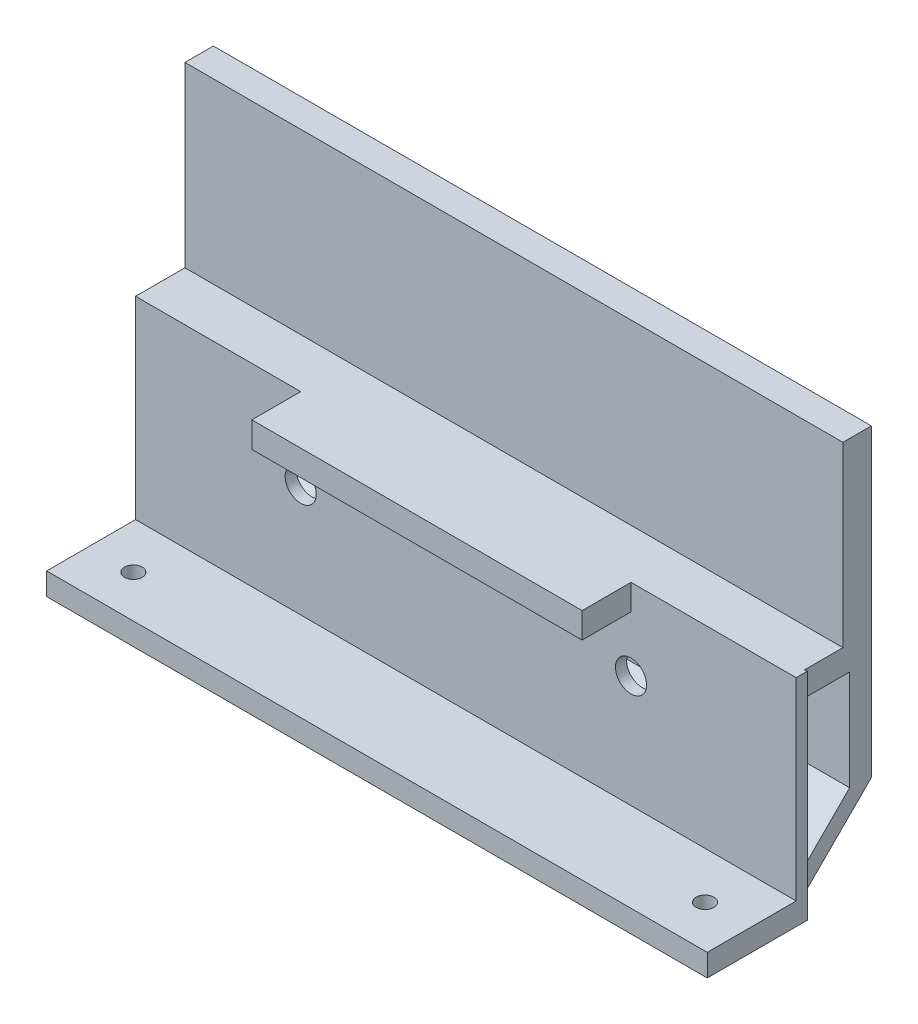
ISO-10303-21;
HEADER;
FILE_DESCRIPTION(('STEP AP214'),'2;1');
FILE_NAME('part.step','',(''),(''),'','','');
FILE_SCHEMA(('AUTOMOTIVE_DESIGN { 1 0 10303 214 1 1 1 1 }'));
ENDSEC;
DATA;
#1=APPLICATION_CONTEXT('core data for automotive mechanical design processes');
#2=APPLICATION_PROTOCOL_DEFINITION('international standard','automotive_design',2000,#1);
#3=PRODUCT_CONTEXT('',#1,'mechanical');
#4=PRODUCT('Part','Part','',(#3));
#5=PRODUCT_RELATED_PRODUCT_CATEGORY('part','',(#4));
#6=PRODUCT_DEFINITION_FORMATION('','',#4);
#7=PRODUCT_DEFINITION_CONTEXT('part definition',#1,'design');
#8=PRODUCT_DEFINITION('design','',#6,#7);
#9=PRODUCT_DEFINITION_SHAPE('','',#8);
#10=(LENGTH_UNIT() NAMED_UNIT(*) SI_UNIT(.MILLI.,.METRE.));
#11=(NAMED_UNIT(*) PLANE_ANGLE_UNIT() SI_UNIT($,.RADIAN.));
#12=(NAMED_UNIT(*) SI_UNIT($,.STERADIAN.) SOLID_ANGLE_UNIT());
#13=UNCERTAINTY_MEASURE_WITH_UNIT(LENGTH_MEASURE(1.E-05),#10,'distance_accuracy_value','');
#14=(GEOMETRIC_REPRESENTATION_CONTEXT(3) GLOBAL_UNCERTAINTY_ASSIGNED_CONTEXT((#13)) GLOBAL_UNIT_ASSIGNED_CONTEXT((#10,
#11,#12)) REPRESENTATION_CONTEXT('',''));
#15=CARTESIAN_POINT('',(0.,0.,0.));
#16=DIRECTION('',(0.,0.,1.));
#17=DIRECTION('',(1.,0.,0.));
#18=AXIS2_PLACEMENT_3D('',#15,#16,#17);
#19=CARTESIAN_POINT('',(0.,48.5,-36.4955621612228));
#20=DIRECTION('',(0.,-1.,0.));
#21=DIRECTION('',(0.,0.,-1.));
#22=AXIS2_PLACEMENT_3D('',#19,#20,#21);
#23=PLANE('',#22);
#24=DIRECTION('',(1.,0.,0.));
#25=VECTOR('',#24,1.);
#26=CARTESIAN_POINT('',(68.543865825632,48.5,-47.5965621612228));
#27=LINE('',#26,#25);
#28=CARTESIAN_POINT('',(-79.456134174368,48.5,-47.5965621612228));
#29=VERTEX_POINT('',#28);
#30=CARTESIAN_POINT('',(68.543865825632,48.5,-47.5965621612228));
#31=VERTEX_POINT('',#30);
#32=EDGE_CURVE('E64',#29,#31,#27,.T.);
#33=ORIENTED_EDGE('',*,*,#32,.F.);
#34=DIRECTION('',(0.,0.,-1.));
#35=VECTOR('',#34,1.);
#36=CARTESIAN_POINT('',(-79.456134174368,48.5,-36.4955621612228));
#37=LINE('',#36,#35);
#38=CARTESIAN_POINT('',(-79.456134174368,48.5,-36.4955621612228));
#39=VERTEX_POINT('',#38);
#40=EDGE_CURVE('E342',#39,#29,#37,.T.);
#41=ORIENTED_EDGE('',*,*,#40,.F.);
#42=DIRECTION('',(-1.,0.,0.));
#43=VECTOR('',#42,1.);
#44=CARTESIAN_POINT('',(0.,48.5,-36.4955621612228));
#45=LINE('',#44,#43);
#46=CARTESIAN_POINT('',(-42.308634174368,48.5,-36.4955621612228));
#47=VERTEX_POINT('',#46);
#48=EDGE_CURVE('E332',#47,#39,#45,.T.);
#49=ORIENTED_EDGE('',*,*,#48,.F.);
#50=DIRECTION('',(0.,0.,-1.));
#51=VECTOR('',#50,1.);
#52=CARTESIAN_POINT('',(-42.308634174368,48.5,-25.4955621612228));
#53=LINE('',#52,#51);
#54=CARTESIAN_POINT('',(-42.308634174368,48.5,-25.4955621612228));
#55=VERTEX_POINT('',#54);
#56=EDGE_CURVE('E247',#55,#47,#53,.T.);
#57=ORIENTED_EDGE('',*,*,#56,.F.);
#58=DIRECTION('',(-1.,0.,0.));
#59=VECTOR('',#58,1.);
#60=CARTESIAN_POINT('',(0.,48.5,-25.4955621612228));
#61=LINE('',#60,#59);
#62=CARTESIAN_POINT('',(31.986365825632,48.5,-25.4955621612228));
#63=VERTEX_POINT('',#62);
#64=EDGE_CURVE('E229',#63,#55,#61,.T.);
#65=ORIENTED_EDGE('',*,*,#64,.F.);
#66=DIRECTION('',(0.,0.,-1.));
#67=VECTOR('',#66,1.);
#68=CARTESIAN_POINT('',(31.986365825632,48.5,-25.4955621612228));
#69=LINE('',#68,#67);
#70=CARTESIAN_POINT('',(31.986365825632,48.5,-36.4955621612228));
#71=VERTEX_POINT('',#70);
#72=EDGE_CURVE('E249',#63,#71,#69,.T.);
#73=ORIENTED_EDGE('',*,*,#72,.T.);
#74=CARTESIAN_POINT('',(69.133865825632,48.5,-36.4955621612228));
#75=VERTEX_POINT('',#74);
#76=EDGE_CURVE('E333',#75,#71,#45,.T.);
#77=ORIENTED_EDGE('',*,*,#76,.F.);
#78=DIRECTION('',(0.,0.,-1.));
#79=VECTOR('',#78,1.);
#80=CARTESIAN_POINT('',(69.133865825632,48.5,-36.4955621612228));
#81=LINE('',#80,#79);
#82=CARTESIAN_POINT('',(69.133865825632,48.5,-38.9965621612228));
#83=VERTEX_POINT('',#82);
#84=EDGE_CURVE('E349',#75,#83,#81,.T.);
#85=ORIENTED_EDGE('',*,*,#84,.T.);
#86=DIRECTION('',(-1.,0.,0.));
#87=VECTOR('',#86,1.);
#88=CARTESIAN_POINT('',(0.,48.5,-38.9965621612228));
#89=LINE('',#88,#87);
#90=CARTESIAN_POINT('',(68.543865825632,48.5,-38.9965621612228));
#91=VERTEX_POINT('',#90);
#92=EDGE_CURVE('E311',#83,#91,#89,.T.);
#93=ORIENTED_EDGE('',*,*,#92,.T.);
#94=DIRECTION('',(0.,0.,-1.));
#95=VECTOR('',#94,1.);
#96=CARTESIAN_POINT('',(68.543865825632,48.5,0.));
#97=LINE('',#96,#95);
#98=EDGE_CURVE('E300',#91,#31,#97,.T.);
#99=ORIENTED_EDGE('',*,*,#98,.T.);
#100=EDGE_LOOP('',(#33,#41,#49,#57,#65,#73,#77,#85,#93,#99));
#101=FACE_BOUND('',#100,.T.);
#102=ADVANCED_FACE('F47',(#101),#23,.F.);
#103=CARTESIAN_POINT('',(-42.308634174368,30.25,-184.495562161223));
#104=DIRECTION('',(0.,0.,1.));
#105=DIRECTION('',(1.,0.,0.));
#106=AXIS2_PLACEMENT_3D('',#103,#104,#105);
#107=CYLINDRICAL_SURFACE('',#106,3.5);
#108=CARTESIAN_POINT('',(-42.308634174368,30.25,-38.9965621612228));
#109=DIRECTION('',(0.,0.,1.));
#110=DIRECTION('',(1.,0.,0.));
#111=AXIS2_PLACEMENT_3D('',#108,#109,#110);
#112=CIRCLE('',#111,3.5);
#113=CARTESIAN_POINT('',(-38.808634174368,30.25,-38.9965621612228));
#114=VERTEX_POINT('',#113);
#115=EDGE_CURVE('E275',#114,#114,#112,.F.);
#116=ORIENTED_EDGE('',*,*,#115,.T.);
#117=EDGE_LOOP('',(#116));
#118=FACE_BOUND('',#117,.T.);
#119=CARTESIAN_POINT('',(-42.308634174368,30.25,-36.4955621612228));
#120=DIRECTION('',(0.,0.,1.));
#121=DIRECTION('',(1.,0.,0.));
#122=AXIS2_PLACEMENT_3D('',#119,#120,#121);
#123=CIRCLE('',#122,3.5);
#124=CARTESIAN_POINT('',(-38.808634174368,30.25,-36.4955621612228));
#125=VERTEX_POINT('',#124);
#126=EDGE_CURVE('E287',#125,#125,#123,.T.);
#127=ORIENTED_EDGE('',*,*,#126,.T.);
#128=EDGE_LOOP('',(#127));
#129=FACE_BOUND('',#128,.T.);
#130=ADVANCED_FACE('F472',(#118,#129),#107,.F.);
#131=CARTESIAN_POINT('',(31.986365825632,30.25,-184.495562161223));
#132=DIRECTION('',(0.,0.,1.));
#133=DIRECTION('',(1.,0.,0.));
#134=AXIS2_PLACEMENT_3D('',#131,#132,#133);
#135=CYLINDRICAL_SURFACE('',#134,3.5);
#136=CARTESIAN_POINT('',(31.986365825632,30.25,-38.9965621612228));
#137=DIRECTION('',(0.,0.,1.));
#138=DIRECTION('',(1.,0.,0.));
#139=AXIS2_PLACEMENT_3D('',#136,#137,#138);
#140=CIRCLE('',#139,3.5);
#141=CARTESIAN_POINT('',(35.486365825632,30.25,-38.9965621612228));
#142=VERTEX_POINT('',#141);
#143=EDGE_CURVE('E51',#142,#142,#140,.F.);
#144=ORIENTED_EDGE('',*,*,#143,.T.);
#145=EDGE_LOOP('',(#144));
#146=FACE_BOUND('',#145,.T.);
#147=CARTESIAN_POINT('',(31.986365825632,30.25,-36.4955621612228));
#148=DIRECTION('',(0.,0.,1.));
#149=DIRECTION('',(1.,0.,0.));
#150=AXIS2_PLACEMENT_3D('',#147,#148,#149);
#151=CIRCLE('',#150,3.5);
#152=CARTESIAN_POINT('',(35.486365825632,30.25,-36.4955621612228));
#153=VERTEX_POINT('',#152);
#154=EDGE_CURVE('E288',#153,#153,#151,.T.);
#155=ORIENTED_EDGE('',*,*,#154,.T.);
#156=EDGE_LOOP('',(#155));
#157=FACE_BOUND('',#156,.T.);
#158=ADVANCED_FACE('F477',(#146,#157),#135,.F.);
#159=CARTESIAN_POINT('',(0.,5.,-16.4955621612228));
#160=DIRECTION('',(0.,0.,-1.));
#161=DIRECTION('',(-1.,0.,0.));
#162=AXIS2_PLACEMENT_3D('',#159,#160,#161);
#163=PLANE('',#162);
#164=DIRECTION('',(1.,0.,0.));
#165=VECTOR('',#164,1.);
#166=CARTESIAN_POINT('',(0.,0.,-16.4955621612228));
#167=LINE('',#166,#165);
#168=CARTESIAN_POINT('',(-79.456134174368,0.,-16.4955621612228));
#169=VERTEX_POINT('',#168);
#170=CARTESIAN_POINT('',(69.133865825632,0.,-16.4955621612228));
#171=VERTEX_POINT('',#170);
#172=EDGE_CURVE('E345',#169,#171,#167,.T.);
#173=ORIENTED_EDGE('',*,*,#172,.T.);
#174=DIRECTION('',(0.,-1.,0.));
#175=VECTOR('',#174,1.);
#176=CARTESIAN_POINT('',(69.133865825632,5.,-16.4955621612228));
#177=LINE('',#176,#175);
#178=CARTESIAN_POINT('',(69.133865825632,5.,-16.4955621612228));
#179=VERTEX_POINT('',#178);
#180=EDGE_CURVE('E13',#179,#171,#177,.T.);
#181=ORIENTED_EDGE('',*,*,#180,.F.);
#182=DIRECTION('',(1.,0.,0.));
#183=VECTOR('',#182,1.);
#184=CARTESIAN_POINT('',(0.,5.,-16.4955621612228));
#185=LINE('',#184,#183);
#186=CARTESIAN_POINT('',(-79.456134174368,5.,-16.4955621612228));
#187=VERTEX_POINT('',#186);
#188=EDGE_CURVE('E352',#187,#179,#185,.T.);
#189=ORIENTED_EDGE('',*,*,#188,.F.);
#190=DIRECTION('',(0.,-1.,0.));
#191=VECTOR('',#190,1.);
#192=CARTESIAN_POINT('',(-79.456134174368,5.,-16.4955621612228));
#193=LINE('',#192,#191);
#194=EDGE_CURVE('E363',#187,#169,#193,.T.);
#195=ORIENTED_EDGE('',*,*,#194,.T.);
#196=EDGE_LOOP('',(#173,#181,#189,#195));
#197=FACE_BOUND('',#196,.T.);
#198=ADVANCED_FACE('F49',(#197),#163,.F.);
#199=CARTESIAN_POINT('',(69.133865825632,5.,0.));
#200=DIRECTION('',(-1.,0.,0.));
#201=DIRECTION('',(0.,0.,1.));
#202=AXIS2_PLACEMENT_3D('',#199,#200,#201);
#203=PLANE('',#202);
#204=DIRECTION('',(0.,0.,-1.));
#205=VECTOR('',#204,1.);
#206=CARTESIAN_POINT('',(69.133865825632,0.,0.));
#207=LINE('',#206,#205);
#208=CARTESIAN_POINT('',(69.133865825632,0.,-38.9955621612228));
#209=VERTEX_POINT('',#208);
#210=EDGE_CURVE('E366',#171,#209,#207,.T.);
#211=ORIENTED_EDGE('',*,*,#210,.T.);
#212=DIRECTION('',(0.,-1.,0.));
#213=VECTOR('',#212,1.);
#214=CARTESIAN_POINT('',(69.133865825632,5.,-38.9955621612228));
#215=LINE('',#214,#213);
#216=CARTESIAN_POINT('',(69.133865825632,5.,-38.9955621612228));
#217=VERTEX_POINT('',#216);
#218=EDGE_CURVE('E56',#217,#209,#215,.T.);
#219=ORIENTED_EDGE('',*,*,#218,.F.);
#220=DIRECTION('',(0.,0.,-1.));
#221=VECTOR('',#220,1.);
#222=CARTESIAN_POINT('',(69.133865825632,5.,-36.4955621612228));
#223=LINE('',#222,#221);
#224=CARTESIAN_POINT('',(69.133865825632,5.,-38.9965621612228));
#225=VERTEX_POINT('',#224);
#226=EDGE_CURVE('E346',#217,#225,#223,.T.);
#227=ORIENTED_EDGE('',*,*,#226,.T.);
#228=DIRECTION('',(0.,-1.,0.));
#229=VECTOR('',#228,1.);
#230=CARTESIAN_POINT('',(69.133865825632,0.,-38.9965621612228));
#231=LINE('',#230,#229);
#232=EDGE_CURVE('E322',#83,#225,#231,.T.);
#233=ORIENTED_EDGE('',*,*,#232,.F.);
#234=ORIENTED_EDGE('',*,*,#84,.F.);
#235=DIRECTION('',(0.,-1.,0.));
#236=VECTOR('',#235,1.);
#237=CARTESIAN_POINT('',(69.133865825632,0.,-36.4955621612228));
#238=LINE('',#237,#236);
#239=CARTESIAN_POINT('',(69.133865825632,5.,-36.4955621612228));
#240=VERTEX_POINT('',#239);
#241=EDGE_CURVE('E336',#75,#240,#238,.T.);
#242=ORIENTED_EDGE('',*,*,#241,.T.);
#243=DIRECTION('',(0.,0.,-1.));
#244=VECTOR('',#243,1.);
#245=CARTESIAN_POINT('',(69.133865825632,5.,0.));
#246=LINE('',#245,#244);
#247=EDGE_CURVE('E355',#179,#240,#246,.T.);
#248=ORIENTED_EDGE('',*,*,#247,.F.);
#249=ORIENTED_EDGE('',*,*,#180,.T.);
#250=EDGE_LOOP('',(#211,#219,#227,#233,#234,#242,#248,#249));
#251=FACE_BOUND('',#250,.T.);
#252=ADVANCED_FACE('F432',(#251),#203,.F.);
#253=CARTESIAN_POINT('',(0.,5.,-38.9955621612228));
#254=DIRECTION('',(0.,0.,-1.));
#255=DIRECTION('',(-1.,0.,0.));
#256=AXIS2_PLACEMENT_3D('',#253,#254,#255);
#257=PLANE('',#256);
#258=DIRECTION('',(1.,0.,0.));
#259=VECTOR('',#258,1.);
#260=CARTESIAN_POINT('',(0.,0.,-38.9955621612228));
#261=LINE('',#260,#259);
#262=CARTESIAN_POINT('',(-79.456134174368,0.,-38.9955621612228));
#263=VERTEX_POINT('',#262);
#264=EDGE_CURVE('E369',#263,#209,#261,.T.);
#265=ORIENTED_EDGE('',*,*,#264,.F.);
#266=DIRECTION('',(0.,-1.,0.));
#267=VECTOR('',#266,1.);
#268=CARTESIAN_POINT('',(-79.456134174368,5.,-38.9955621612228));
#269=LINE('',#268,#267);
#270=CARTESIAN_POINT('',(-79.456134174368,5.,-38.9955621612228));
#271=VERTEX_POINT('',#270);
#272=EDGE_CURVE('E375',#271,#263,#269,.T.);
#273=ORIENTED_EDGE('',*,*,#272,.F.);
#274=DIRECTION('',(1.,0.,0.));
#275=VECTOR('',#274,1.);
#276=CARTESIAN_POINT('',(0.,5.,-38.9955621612228));
#277=LINE('',#276,#275);
#278=EDGE_CURVE('E358',#271,#217,#277,.T.);
#279=ORIENTED_EDGE('',*,*,#278,.T.);
#280=ORIENTED_EDGE('',*,*,#218,.T.);
#281=EDGE_LOOP('',(#265,#273,#279,#280));
#282=FACE_BOUND('',#281,.T.);
#283=ADVANCED_FACE('F430',(#282),#257,.T.);
#284=CARTESIAN_POINT('',(-79.456134174368,5.,0.));
#285=DIRECTION('',(1.,0.,0.));
#286=DIRECTION('',(0.,0.,-1.));
#287=AXIS2_PLACEMENT_3D('',#284,#285,#286);
#288=PLANE('',#287);
#289=DIRECTION('',(0.,0.,1.));
#290=VECTOR('',#289,1.);
#291=CARTESIAN_POINT('',(-79.456134174368,43.0152324436079,0.));
#292=LINE('',#291,#290);
#293=CARTESIAN_POINT('',(-79.456134174368,43.0152324436079,-49.1099327899107));
#294=VERTEX_POINT('',#293);
#295=CARTESIAN_POINT('',(-79.456134174368,43.0152324436079,-38.9965621612228));
#296=VERTEX_POINT('',#295);
#297=EDGE_CURVE('E284',#294,#296,#292,.T.);
#298=ORIENTED_EDGE('',*,*,#297,.T.);
#299=DIRECTION('',(0.,-1.,0.));
#300=VECTOR('',#299,1.);
#301=CARTESIAN_POINT('',(-79.456134174368,5.,-38.9965621612228));
#302=LINE('',#301,#300);
#303=CARTESIAN_POINT('',(-79.456134174368,10.3369467408914,-38.9965621612228));
#304=VERTEX_POINT('',#303);
#305=EDGE_CURVE('E278',#296,#304,#302,.T.);
#306=ORIENTED_EDGE('',*,*,#305,.T.);
#307=DIRECTION('',(0.,0.707106781186565,-0.70710678118653));
#308=VECTOR('',#307,1.);
#309=CARTESIAN_POINT('',(-79.456134174368,-11.8298077101658,-16.8298077101667));
#310=LINE('',#309,#308);
#311=CARTESIAN_POINT('',(-79.456134174368,20.4503173695798,-49.1099327899107));
#312=VERTEX_POINT('',#311);
#313=EDGE_CURVE('E281',#304,#312,#310,.T.);
#314=ORIENTED_EDGE('',*,*,#313,.T.);
#315=DIRECTION('',(0.,1.,0.));
#316=VECTOR('',#315,1.);
#317=CARTESIAN_POINT('',(-79.456134174368,5.,-49.1099327899107));
#318=LINE('',#317,#316);
#319=EDGE_CURVE('E272',#312,#294,#318,.T.);
#320=ORIENTED_EDGE('',*,*,#319,.T.);
#321=EDGE_LOOP('',(#298,#306,#314,#320));
#322=FACE_BOUND('',#321,.T.);
#323=DIRECTION('',(0.,0.,1.));
#324=VECTOR('',#323,1.);
#325=CARTESIAN_POINT('',(-79.456134174368,0.,0.));
#326=LINE('',#325,#324);
#327=EDGE_CURVE('E356',#263,#169,#326,.T.);
#328=ORIENTED_EDGE('',*,*,#327,.T.);
#329=ORIENTED_EDGE('',*,*,#194,.F.);
#330=DIRECTION('',(0.,0.,1.));
#331=VECTOR('',#330,1.);
#332=CARTESIAN_POINT('',(-79.456134174368,5.,0.));
#333=LINE('',#332,#331);
#334=CARTESIAN_POINT('',(-79.456134174368,5.,-36.4955621612228));
#335=VERTEX_POINT('',#334);
#336=EDGE_CURVE('E361',#335,#187,#333,.T.);
#337=ORIENTED_EDGE('',*,*,#336,.F.);
#338=DIRECTION('',(0.,-1.,0.));
#339=VECTOR('',#338,1.);
#340=CARTESIAN_POINT('',(-79.456134174368,0.,-36.4955621612228));
#341=LINE('',#340,#339);
#342=EDGE_CURVE('E329',#39,#335,#341,.T.);
#343=ORIENTED_EDGE('',*,*,#342,.F.);
#344=ORIENTED_EDGE('',*,*,#40,.T.);
#345=DIRECTION('',(0.,-1.,0.));
#346=VECTOR('',#345,1.);
#347=CARTESIAN_POINT('',(-79.456134174368,88.5,-47.5965621612228));
#348=LINE('',#347,#346);
#349=CARTESIAN_POINT('',(-79.456134174368,88.5,-47.5965621612228));
#350=VERTEX_POINT('',#349);
#351=EDGE_CURVE('E207',#350,#29,#348,.T.);
#352=ORIENTED_EDGE('',*,*,#351,.F.);
#353=DIRECTION('',(0.,0.,1.));
#354=VECTOR('',#353,1.);
#355=CARTESIAN_POINT('',(-79.456134174368,88.5,-53.9965621612228));
#356=LINE('',#355,#354);
#357=CARTESIAN_POINT('',(-79.456134174368,88.5,-53.9965621612228));
#358=VERTEX_POINT('',#357);
#359=EDGE_CURVE('E204',#358,#350,#356,.T.);
#360=ORIENTED_EDGE('',*,*,#359,.F.);
#361=DIRECTION('',(0.,1.,0.));
#362=VECTOR('',#361,1.);
#363=CARTESIAN_POINT('',(-79.456134174368,0.,-53.9965621612228));
#364=LINE('',#363,#362);
#365=CARTESIAN_POINT('',(-79.456134174368,19.9999999999999,-53.9965621612228));
#366=VERTEX_POINT('',#365);
#367=EDGE_CURVE('E190',#366,#358,#364,.T.);
#368=ORIENTED_EDGE('',*,*,#367,.F.);
#369=DIRECTION('',(0.,0.707106781186544,-0.707106781186551));
#370=VECTOR('',#369,1.);
#371=CARTESIAN_POINT('',(-79.456134174368,-16.9982810806114,-16.9982810806112));
#372=LINE('',#371,#370);
#373=CARTESIAN_POINT('',(-79.456134174368,5.,-38.9965621612228));
#374=VERTEX_POINT('',#373);
#375=EDGE_CURVE('E201',#374,#366,#372,.T.);
#376=ORIENTED_EDGE('',*,*,#375,.F.);
#377=DIRECTION('',(0.,0.,-1.));
#378=VECTOR('',#377,1.);
#379=CARTESIAN_POINT('',(-79.456134174368,5.,-36.4955621612228));
#380=LINE('',#379,#378);
#381=EDGE_CURVE('E343',#271,#374,#380,.T.);
#382=ORIENTED_EDGE('',*,*,#381,.F.);
#383=ORIENTED_EDGE('',*,*,#272,.T.);
#384=EDGE_LOOP('',(#328,#329,#337,#343,#344,#352,#360,#368,#376,#382,#383));
#385=FACE_BOUND('',#384,.T.);
#386=ADVANCED_FACE('F205',(#322,#385),#288,.F.);
#387=CARTESIAN_POINT('',(0.,5.,0.));
#388=DIRECTION('',(0.,1.,0.));
#389=DIRECTION('',(0.,0.,1.));
#390=AXIS2_PLACEMENT_3D('',#387,#388,#389);
#391=PLANE('',#390);
#392=CARTESIAN_POINT('',(59.133865825632,5.,-25.9955621612228));
#393=DIRECTION('',(0.,-1.,0.));
#394=DIRECTION('',(0.,0.,-1.));
#395=AXIS2_PLACEMENT_3D('',#392,#393,#394);
#396=CIRCLE('',#395,2.);
#397=CARTESIAN_POINT('',(59.133865825632,5.,-27.9955621612228));
#398=VERTEX_POINT('',#397);
#399=EDGE_CURVE('E308',#398,#398,#396,.T.);
#400=ORIENTED_EDGE('',*,*,#399,.T.);
#401=EDGE_LOOP('',(#400));
#402=FACE_BOUND('',#401,.T.);
#403=CARTESIAN_POINT('',(-69.456134174368,5.,-25.9955621612228));
#404=DIRECTION('',(0.,-1.,0.));
#405=DIRECTION('',(0.,0.,-1.));
#406=AXIS2_PLACEMENT_3D('',#403,#404,#405);
#407=CIRCLE('',#406,2.);
#408=CARTESIAN_POINT('',(-69.456134174368,5.,-27.9955621612228));
#409=VERTEX_POINT('',#408);
#410=EDGE_CURVE('E307',#409,#409,#407,.T.);
#411=ORIENTED_EDGE('',*,*,#410,.T.);
#412=EDGE_LOOP('',(#411));
#413=FACE_BOUND('',#412,.T.);
#414=DIRECTION('',(1.,0.,0.));
#415=VECTOR('',#414,1.);
#416=CARTESIAN_POINT('',(0.,5.,-36.4955621612228));
#417=LINE('',#416,#415);
#418=EDGE_CURVE('E339',#335,#240,#417,.T.);
#419=ORIENTED_EDGE('',*,*,#418,.F.);
#420=ORIENTED_EDGE('',*,*,#336,.T.);
#421=ORIENTED_EDGE('',*,*,#188,.T.);
#422=ORIENTED_EDGE('',*,*,#247,.T.);
#423=EDGE_LOOP('',(#419,#420,#421,#422));
#424=FACE_BOUND('',#423,.T.);
#425=ADVANCED_FACE('F484',(#402,#413,#424),#391,.T.);
#426=CARTESIAN_POINT('',(0.,0.,0.));
#427=DIRECTION('',(0.,1.,0.));
#428=DIRECTION('',(0.,0.,1.));
#429=AXIS2_PLACEMENT_3D('',#426,#427,#428);
#430=PLANE('',#429);
#431=CARTESIAN_POINT('',(59.133865825632,0.,-25.9955621612228));
#432=DIRECTION('',(0.,-1.,0.));
#433=DIRECTION('',(0.,0.,-1.));
#434=AXIS2_PLACEMENT_3D('',#431,#432,#433);
#435=CIRCLE('',#434,2.);
#436=CARTESIAN_POINT('',(59.133865825632,0.,-27.9955621612228));
#437=VERTEX_POINT('',#436);
#438=EDGE_CURVE('E312',#437,#437,#435,.T.);
#439=ORIENTED_EDGE('',*,*,#438,.F.);
#440=EDGE_LOOP('',(#439));
#441=FACE_BOUND('',#440,.T.);
#442=CARTESIAN_POINT('',(-69.456134174368,0.,-25.9955621612228));
#443=DIRECTION('',(0.,-1.,0.));
#444=DIRECTION('',(0.,0.,-1.));
#445=AXIS2_PLACEMENT_3D('',#442,#443,#444);
#446=CIRCLE('',#445,2.);
#447=CARTESIAN_POINT('',(-69.456134174368,0.,-27.9955621612228));
#448=VERTEX_POINT('',#447);
#449=EDGE_CURVE('E315',#448,#448,#446,.T.);
#450=ORIENTED_EDGE('',*,*,#449,.F.);
#451=EDGE_LOOP('',(#450));
#452=FACE_BOUND('',#451,.T.);
#453=ORIENTED_EDGE('',*,*,#172,.F.);
#454=ORIENTED_EDGE('',*,*,#327,.F.);
#455=ORIENTED_EDGE('',*,*,#264,.T.);
#456=ORIENTED_EDGE('',*,*,#210,.F.);
#457=EDGE_LOOP('',(#453,#454,#455,#456));
#458=FACE_BOUND('',#457,.T.);
#459=ADVANCED_FACE('F429',(#441,#452,#458),#430,.F.);
#460=CARTESIAN_POINT('',(0.,5.,-36.4955621612228));
#461=DIRECTION('',(0.,1.,0.));
#462=DIRECTION('',(0.,0.,1.));
#463=AXIS2_PLACEMENT_3D('',#460,#461,#462);
#464=PLANE('',#463);
#465=ORIENTED_EDGE('',*,*,#278,.F.);
#466=ORIENTED_EDGE('',*,*,#381,.T.);
#467=DIRECTION('',(1.,0.,0.));
#468=VECTOR('',#467,1.);
#469=CARTESIAN_POINT('',(0.,5.,-38.9965621612228));
#470=LINE('',#469,#468);
#471=CARTESIAN_POINT('',(68.543865825632,5.,-38.9965621612228));
#472=VERTEX_POINT('',#471);
#473=EDGE_CURVE('E326',#374,#472,#470,.T.);
#474=ORIENTED_EDGE('',*,*,#473,.T.);
#475=EDGE_CURVE('E325',#472,#225,#470,.T.);
#476=ORIENTED_EDGE('',*,*,#475,.T.);
#477=ORIENTED_EDGE('',*,*,#226,.F.);
#478=EDGE_LOOP('',(#465,#466,#474,#476,#477));
#479=FACE_BOUND('',#478,.T.);
#480=ADVANCED_FACE('F418',(#479),#464,.F.);
#481=CARTESIAN_POINT('',(0.,0.,-36.4955621612228));
#482=DIRECTION('',(0.,0.,-1.));
#483=DIRECTION('',(-1.,0.,0.));
#484=AXIS2_PLACEMENT_3D('',#481,#482,#483);
#485=PLANE('',#484);
#486=ORIENTED_EDGE('',*,*,#76,.T.);
#487=DIRECTION('',(0.,-1.,0.));
#488=VECTOR('',#487,1.);
#489=CARTESIAN_POINT('',(31.986365825632,0.,-36.4955621612228));
#490=LINE('',#489,#488);
#491=CARTESIAN_POINT('',(31.986365825632,42.75,-36.4955621612228));
#492=VERTEX_POINT('',#491);
#493=EDGE_CURVE('E225',#71,#492,#490,.T.);
#494=ORIENTED_EDGE('',*,*,#493,.T.);
#495=DIRECTION('',(-1.,0.,0.));
#496=VECTOR('',#495,1.);
#497=CARTESIAN_POINT('',(0.,42.75,-36.4955621612228));
#498=LINE('',#497,#496);
#499=CARTESIAN_POINT('',(-42.308634174368,42.75,-36.4955621612228));
#500=VERTEX_POINT('',#499);
#501=EDGE_CURVE('E230',#492,#500,#498,.T.);
#502=ORIENTED_EDGE('',*,*,#501,.T.);
#503=DIRECTION('',(0.,1.,0.));
#504=VECTOR('',#503,1.);
#505=CARTESIAN_POINT('',(-42.308634174368,0.,-36.4955621612228));
#506=LINE('',#505,#504);
#507=EDGE_CURVE('E72',#500,#47,#506,.T.);
#508=ORIENTED_EDGE('',*,*,#507,.T.);
#509=ORIENTED_EDGE('',*,*,#48,.T.);
#510=ORIENTED_EDGE('',*,*,#342,.T.);
#511=ORIENTED_EDGE('',*,*,#418,.T.);
#512=ORIENTED_EDGE('',*,*,#241,.F.);
#513=EDGE_LOOP('',(#486,#494,#502,#508,#509,#510,#511,#512));
#514=FACE_BOUND('',#513,.T.);
#515=ORIENTED_EDGE('',*,*,#154,.F.);
#516=EDGE_LOOP('',(#515));
#517=FACE_BOUND('',#516,.T.);
#518=ORIENTED_EDGE('',*,*,#126,.F.);
#519=EDGE_LOOP('',(#518));
#520=FACE_BOUND('',#519,.T.);
#521=ADVANCED_FACE('F440',(#514,#517,#520),#485,.F.);
#522=CARTESIAN_POINT('',(0.,0.,-38.9965621612228));
#523=DIRECTION('',(0.,0.,-1.));
#524=DIRECTION('',(-1.,0.,0.));
#525=AXIS2_PLACEMENT_3D('',#522,#523,#524);
#526=PLANE('',#525);
#527=DIRECTION('',(0.,-1.,0.));
#528=VECTOR('',#527,1.);
#529=CARTESIAN_POINT('',(68.543865825632,0.,-38.9965621612228));
#530=LINE('',#529,#528);
#531=CARTESIAN_POINT('',(68.543865825632,43.0152324436079,-38.9965621612228));
#532=VERTEX_POINT('',#531);
#533=EDGE_CURVE('E297',#91,#532,#530,.T.);
#534=ORIENTED_EDGE('',*,*,#533,.F.);
#535=ORIENTED_EDGE('',*,*,#92,.F.);
#536=ORIENTED_EDGE('',*,*,#232,.T.);
#537=ORIENTED_EDGE('',*,*,#475,.F.);
#538=CARTESIAN_POINT('',(68.543865825632,10.3369467408914,-38.9965621612228));
#539=VERTEX_POINT('',#538);
#540=EDGE_CURVE('E296',#539,#472,#530,.T.);
#541=ORIENTED_EDGE('',*,*,#540,.F.);
#542=DIRECTION('',(1.,0.,0.));
#543=VECTOR('',#542,1.);
#544=CARTESIAN_POINT('',(-89.456134174368,10.3369467408914,-38.9965621612228));
#545=LINE('',#544,#543);
#546=EDGE_CURVE('E260',#304,#539,#545,.T.);
#547=ORIENTED_EDGE('',*,*,#546,.F.);
#548=ORIENTED_EDGE('',*,*,#305,.F.);
#549=DIRECTION('',(1.,0.,0.));
#550=VECTOR('',#549,1.);
#551=CARTESIAN_POINT('',(-89.456134174368,43.0152324436079,-38.9965621612228));
#552=LINE('',#551,#550);
#553=EDGE_CURVE('E261',#296,#532,#552,.T.);
#554=ORIENTED_EDGE('',*,*,#553,.T.);
#555=EDGE_LOOP('',(#534,#535,#536,#537,#541,#547,#548,#554));
#556=FACE_BOUND('',#555,.T.);
#557=ORIENTED_EDGE('',*,*,#143,.F.);
#558=EDGE_LOOP('',(#557));
#559=FACE_BOUND('',#558,.T.);
#560=ORIENTED_EDGE('',*,*,#115,.F.);
#561=EDGE_LOOP('',(#560));
#562=FACE_BOUND('',#561,.T.);
#563=ADVANCED_FACE('F411',(#556,#559,#562),#526,.T.);
#564=CARTESIAN_POINT('',(-69.456134174368,5.,-25.9955621612228));
#565=DIRECTION('',(0.,-1.,0.));
#566=DIRECTION('',(0.,0.,-1.));
#567=AXIS2_PLACEMENT_3D('',#564,#565,#566);
#568=CYLINDRICAL_SURFACE('',#567,2.);
#569=ORIENTED_EDGE('',*,*,#410,.F.);
#570=EDGE_LOOP('',(#569));
#571=FACE_BOUND('',#570,.T.);
#572=ORIENTED_EDGE('',*,*,#449,.T.);
#573=EDGE_LOOP('',(#572));
#574=FACE_BOUND('',#573,.T.);
#575=ADVANCED_FACE('F529',(#571,#574),#568,.F.);
#576=CARTESIAN_POINT('',(59.133865825632,5.,-25.9955621612228));
#577=DIRECTION('',(0.,-1.,0.));
#578=DIRECTION('',(0.,0.,-1.));
#579=AXIS2_PLACEMENT_3D('',#576,#577,#578);
#580=CYLINDRICAL_SURFACE('',#579,2.);
#581=ORIENTED_EDGE('',*,*,#399,.F.);
#582=EDGE_LOOP('',(#581));
#583=FACE_BOUND('',#582,.T.);
#584=ORIENTED_EDGE('',*,*,#438,.T.);
#585=EDGE_LOOP('',(#584));
#586=FACE_BOUND('',#585,.T.);
#587=ADVANCED_FACE('F526',(#583,#586),#580,.F.);
#588=CARTESIAN_POINT('',(68.543865825632,-16.9982810806114,-16.9982810806112));
#589=DIRECTION('',(0.,0.707106781186551,0.707106781186544));
#590=DIRECTION('',(0.,-0.707106781186544,0.707106781186551));
#591=AXIS2_PLACEMENT_3D('',#588,#589,#590);
#592=PLANE('',#591);
#593=ORIENTED_EDGE('',*,*,#375,.T.);
#594=DIRECTION('',(-1.,0.,0.));
#595=VECTOR('',#594,1.);
#596=CARTESIAN_POINT('',(68.543865825632,19.9999999999999,-53.9965621612228));
#597=LINE('',#596,#595);
#598=CARTESIAN_POINT('',(68.543865825632,19.9999999999999,-53.9965621612228));
#599=VERTEX_POINT('',#598);
#600=EDGE_CURVE('E196',#599,#366,#597,.T.);
#601=ORIENTED_EDGE('',*,*,#600,.F.);
#602=DIRECTION('',(0.,0.707106781186544,-0.707106781186551));
#603=VECTOR('',#602,1.);
#604=CARTESIAN_POINT('',(68.543865825632,-16.9982810806114,-16.9982810806112));
#605=LINE('',#604,#603);
#606=EDGE_CURVE('E200',#472,#599,#605,.T.);
#607=ORIENTED_EDGE('',*,*,#606,.F.);
#608=ORIENTED_EDGE('',*,*,#473,.F.);
#609=EDGE_LOOP('',(#593,#601,#607,#608));
#610=FACE_BOUND('',#609,.T.);
#611=ADVANCED_FACE('F422',(#610),#592,.F.);
#612=CARTESIAN_POINT('',(68.543865825632,0.,-53.9965621612228));
#613=DIRECTION('',(0.,0.,1.));
#614=DIRECTION('',(0.,-1.,0.));
#615=AXIS2_PLACEMENT_3D('',#612,#613,#614);
#616=PLANE('',#615);
#617=CARTESIAN_POINT('',(31.986365825632,30.25,-53.9965621612228));
#618=DIRECTION('',(0.,0.,1.));
#619=DIRECTION('',(0.,-1.,0.));
#620=AXIS2_PLACEMENT_3D('',#617,#618,#619);
#621=CIRCLE('',#620,3.5);
#622=CARTESIAN_POINT('',(31.986365825632,26.75,-53.9965621612228));
#623=VERTEX_POINT('',#622);
#624=EDGE_CURVE('E304',#623,#623,#621,.T.);
#625=ORIENTED_EDGE('',*,*,#624,.T.);
#626=EDGE_LOOP('',(#625));
#627=FACE_BOUND('',#626,.T.);
#628=CARTESIAN_POINT('',(-42.308634174368,30.25,-53.9965621612228));
#629=DIRECTION('',(0.,0.,1.));
#630=DIRECTION('',(0.,-1.,0.));
#631=AXIS2_PLACEMENT_3D('',#628,#629,#630);
#632=CIRCLE('',#631,3.5);
#633=CARTESIAN_POINT('',(-42.308634174368,26.75,-53.9965621612228));
#634=VERTEX_POINT('',#633);
#635=EDGE_CURVE('E291',#634,#634,#632,.T.);
#636=ORIENTED_EDGE('',*,*,#635,.T.);
#637=EDGE_LOOP('',(#636));
#638=FACE_BOUND('',#637,.T.);
#639=ORIENTED_EDGE('',*,*,#367,.T.);
#640=DIRECTION('',(-1.,0.,0.));
#641=VECTOR('',#640,1.);
#642=CARTESIAN_POINT('',(-79.456134174368,88.5,-53.9965621612228));
#643=LINE('',#642,#641);
#644=CARTESIAN_POINT('',(68.543865825632,88.5,-53.9965621612228));
#645=VERTEX_POINT('',#644);
#646=EDGE_CURVE('E194',#645,#358,#643,.T.);
#647=ORIENTED_EDGE('',*,*,#646,.F.);
#648=DIRECTION('',(0.,1.,0.));
#649=VECTOR('',#648,1.);
#650=CARTESIAN_POINT('',(68.543865825632,0.,-53.9965621612228));
#651=LINE('',#650,#649);
#652=EDGE_CURVE('E302',#599,#645,#651,.T.);
#653=ORIENTED_EDGE('',*,*,#652,.F.);
#654=ORIENTED_EDGE('',*,*,#600,.T.);
#655=EDGE_LOOP('',(#639,#647,#653,#654));
#656=FACE_BOUND('',#655,.T.);
#657=ADVANCED_FACE('F192',(#627,#638,#656),#616,.F.);
#658=CARTESIAN_POINT('',(68.543865825632,0.,0.));
#659=DIRECTION('',(-1.,0.,0.));
#660=DIRECTION('',(0.,0.,1.));
#661=AXIS2_PLACEMENT_3D('',#658,#659,#660);
#662=PLANE('',#661);
#663=ORIENTED_EDGE('',*,*,#533,.T.);
#664=DIRECTION('',(0.,0.,1.));
#665=VECTOR('',#664,1.);
#666=CARTESIAN_POINT('',(68.543865825632,43.0152324436079,-38.9965621612228));
#667=LINE('',#666,#665);
#668=CARTESIAN_POINT('',(68.543865825632,43.0152324436079,-49.1099327899107));
#669=VERTEX_POINT('',#668);
#670=EDGE_CURVE('E257',#669,#532,#667,.T.);
#671=ORIENTED_EDGE('',*,*,#670,.F.);
#672=DIRECTION('',(0.,1.,0.));
#673=VECTOR('',#672,1.);
#674=CARTESIAN_POINT('',(68.543865825632,43.0152324436079,-49.1099327899107));
#675=LINE('',#674,#673);
#676=CARTESIAN_POINT('',(68.543865825632,20.4503173695798,-49.1099327899107));
#677=VERTEX_POINT('',#676);
#678=EDGE_CURVE('E254',#677,#669,#675,.T.);
#679=ORIENTED_EDGE('',*,*,#678,.F.);
#680=DIRECTION('',(0.,0.707106781186565,-0.70710678118653));
#681=VECTOR('',#680,1.);
#682=CARTESIAN_POINT('',(68.543865825632,20.4503173695798,-49.1099327899107));
#683=LINE('',#682,#681);
#684=EDGE_CURVE('E251',#539,#677,#683,.T.);
#685=ORIENTED_EDGE('',*,*,#684,.F.);
#686=ORIENTED_EDGE('',*,*,#540,.T.);
#687=ORIENTED_EDGE('',*,*,#606,.T.);
#688=ORIENTED_EDGE('',*,*,#652,.T.);
#689=DIRECTION('',(0.,0.,-1.));
#690=VECTOR('',#689,1.);
#691=CARTESIAN_POINT('',(68.543865825632,88.5,-53.9965621612228));
#692=LINE('',#691,#690);
#693=CARTESIAN_POINT('',(68.543865825632,88.5,-47.5965621612228));
#694=VERTEX_POINT('',#693);
#695=EDGE_CURVE('E215',#694,#645,#692,.T.);
#696=ORIENTED_EDGE('',*,*,#695,.F.);
#697=DIRECTION('',(0.,-1.,0.));
#698=VECTOR('',#697,1.);
#699=CARTESIAN_POINT('',(68.543865825632,88.5,-47.5965621612228));
#700=LINE('',#699,#698);
#701=EDGE_CURVE('E220',#694,#31,#700,.T.);
#702=ORIENTED_EDGE('',*,*,#701,.T.);
#703=ORIENTED_EDGE('',*,*,#98,.F.);
#704=EDGE_LOOP('',(#663,#671,#679,#685,#686,#687,#688,#696,#702,#703));
#705=FACE_BOUND('',#704,.T.);
#706=ADVANCED_FACE('F404',(#705),#662,.F.);
#707=CARTESIAN_POINT('',(-42.308634174368,30.25,-49.1099327899107));
#708=DIRECTION('',(0.,0.,-1.));
#709=DIRECTION('',(-1.,0.,0.));
#710=AXIS2_PLACEMENT_3D('',#707,#708,#709);
#711=CIRCLE('',#710,3.5);
#712=CARTESIAN_POINT('',(-45.808634174368,30.25,-49.1099327899107));
#713=VERTEX_POINT('',#712);
#714=EDGE_CURVE('E269',#713,#713,#711,.F.);
#715=ORIENTED_EDGE('',*,*,#714,.T.);
#716=EDGE_LOOP('',(#715));
#717=FACE_BOUND('',#716,.T.);
#718=ORIENTED_EDGE('',*,*,#635,.F.);
#719=EDGE_LOOP('',(#718));
#720=FACE_BOUND('',#719,.T.);
#721=ADVANCED_FACE('F480',(#717,#720),#107,.F.);
#722=CARTESIAN_POINT('',(31.986365825632,30.25,-49.1099327899107));
#723=DIRECTION('',(0.,0.,-1.));
#724=DIRECTION('',(-1.,0.,0.));
#725=AXIS2_PLACEMENT_3D('',#722,#723,#724);
#726=CIRCLE('',#725,3.5);
#727=CARTESIAN_POINT('',(28.486365825632,30.25,-49.1099327899107));
#728=VERTEX_POINT('',#727);
#729=EDGE_CURVE('E263',#728,#728,#726,.F.);
#730=ORIENTED_EDGE('',*,*,#729,.T.);
#731=EDGE_LOOP('',(#730));
#732=FACE_BOUND('',#731,.T.);
#733=ORIENTED_EDGE('',*,*,#624,.F.);
#734=EDGE_LOOP('',(#733));
#735=FACE_BOUND('',#734,.T.);
#736=ADVANCED_FACE('F384',(#732,#735),#135,.F.);
#737=CARTESIAN_POINT('',(-89.456134174368,43.0152324436079,-38.9965621612228));
#738=DIRECTION('',(0.,1.,0.));
#739=DIRECTION('',(0.,0.,1.));
#740=AXIS2_PLACEMENT_3D('',#737,#738,#739);
#741=PLANE('',#740);
#742=DIRECTION('',(1.,0.,0.));
#743=VECTOR('',#742,1.);
#744=CARTESIAN_POINT('',(-89.456134174368,43.0152324436079,-49.1099327899107));
#745=LINE('',#744,#743);
#746=EDGE_CURVE('E264',#294,#669,#745,.T.);
#747=ORIENTED_EDGE('',*,*,#746,.T.);
#748=ORIENTED_EDGE('',*,*,#670,.T.);
#749=ORIENTED_EDGE('',*,*,#553,.F.);
#750=ORIENTED_EDGE('',*,*,#297,.F.);
#751=EDGE_LOOP('',(#747,#748,#749,#750));
#752=FACE_BOUND('',#751,.T.);
#753=ADVANCED_FACE('F408',(#752),#741,.F.);
#754=CARTESIAN_POINT('',(-89.456134174368,20.4503173695798,-49.1099327899107));
#755=DIRECTION('',(0.,-0.70710678118653,-0.707106781186565));
#756=DIRECTION('',(0.,0.707106781186565,-0.70710678118653));
#757=AXIS2_PLACEMENT_3D('',#754,#755,#756);
#758=PLANE('',#757);
#759=ORIENTED_EDGE('',*,*,#546,.T.);
#760=ORIENTED_EDGE('',*,*,#684,.T.);
#761=DIRECTION('',(1.,0.,0.));
#762=VECTOR('',#761,1.);
#763=CARTESIAN_POINT('',(-89.456134174368,20.4503173695798,-49.1099327899107));
#764=LINE('',#763,#762);
#765=EDGE_CURVE('E266',#312,#677,#764,.T.);
#766=ORIENTED_EDGE('',*,*,#765,.F.);
#767=ORIENTED_EDGE('',*,*,#313,.F.);
#768=EDGE_LOOP('',(#759,#760,#766,#767));
#769=FACE_BOUND('',#768,.T.);
#770=ADVANCED_FACE('F391',(#769),#758,.F.);
#771=CARTESIAN_POINT('',(-89.456134174368,43.0152324436079,-49.1099327899107));
#772=DIRECTION('',(0.,0.,-1.));
#773=DIRECTION('',(-1.,0.,0.));
#774=AXIS2_PLACEMENT_3D('',#771,#772,#773);
#775=PLANE('',#774);
#776=ORIENTED_EDGE('',*,*,#729,.F.);
#777=EDGE_LOOP('',(#776));
#778=FACE_BOUND('',#777,.T.);
#779=ORIENTED_EDGE('',*,*,#714,.F.);
#780=EDGE_LOOP('',(#779));
#781=FACE_BOUND('',#780,.T.);
#782=ORIENTED_EDGE('',*,*,#765,.T.);
#783=ORIENTED_EDGE('',*,*,#678,.T.);
#784=ORIENTED_EDGE('',*,*,#746,.F.);
#785=ORIENTED_EDGE('',*,*,#319,.F.);
#786=EDGE_LOOP('',(#782,#783,#784,#785));
#787=FACE_BOUND('',#786,.T.);
#788=ADVANCED_FACE('F387',(#778,#781,#787),#775,.F.);
#789=CARTESIAN_POINT('',(31.986365825632,0.,-25.4955621612228));
#790=DIRECTION('',(1.,0.,0.));
#791=DIRECTION('',(0.,0.,-1.));
#792=AXIS2_PLACEMENT_3D('',#789,#790,#791);
#793=PLANE('',#792);
#794=ORIENTED_EDGE('',*,*,#493,.F.);
#795=ORIENTED_EDGE('',*,*,#72,.F.);
#796=DIRECTION('',(0.,-1.,0.));
#797=VECTOR('',#796,1.);
#798=CARTESIAN_POINT('',(31.986365825632,0.,-25.4955621612228));
#799=LINE('',#798,#797);
#800=CARTESIAN_POINT('',(31.986365825632,42.75,-25.4955621612228));
#801=VERTEX_POINT('',#800);
#802=EDGE_CURVE('E226',#63,#801,#799,.T.);
#803=ORIENTED_EDGE('',*,*,#802,.T.);
#804=DIRECTION('',(0.,0.,-1.));
#805=VECTOR('',#804,1.);
#806=CARTESIAN_POINT('',(31.986365825632,42.75,-25.4955621612228));
#807=LINE('',#806,#805);
#808=EDGE_CURVE('E238',#801,#492,#807,.T.);
#809=ORIENTED_EDGE('',*,*,#808,.T.);
#810=EDGE_LOOP('',(#794,#795,#803,#809));
#811=FACE_BOUND('',#810,.T.);
#812=ADVANCED_FACE('F390',(#811),#793,.T.);
#813=CARTESIAN_POINT('',(-42.308634174368,0.,-25.4955621612228));
#814=DIRECTION('',(-1.,0.,0.));
#815=DIRECTION('',(0.,0.,1.));
#816=AXIS2_PLACEMENT_3D('',#813,#814,#815);
#817=PLANE('',#816);
#818=ORIENTED_EDGE('',*,*,#507,.F.);
#819=DIRECTION('',(0.,0.,-1.));
#820=VECTOR('',#819,1.);
#821=CARTESIAN_POINT('',(-42.308634174368,42.75,-25.4955621612228));
#822=LINE('',#821,#820);
#823=CARTESIAN_POINT('',(-42.308634174368,42.75,-25.4955621612228));
#824=VERTEX_POINT('',#823);
#825=EDGE_CURVE('E245',#824,#500,#822,.T.);
#826=ORIENTED_EDGE('',*,*,#825,.F.);
#827=DIRECTION('',(0.,1.,0.));
#828=VECTOR('',#827,1.);
#829=CARTESIAN_POINT('',(-42.308634174368,0.,-25.4955621612228));
#830=LINE('',#829,#828);
#831=EDGE_CURVE('E232',#824,#55,#830,.T.);
#832=ORIENTED_EDGE('',*,*,#831,.T.);
#833=ORIENTED_EDGE('',*,*,#56,.T.);
#834=EDGE_LOOP('',(#818,#826,#832,#833));
#835=FACE_BOUND('',#834,.T.);
#836=ADVANCED_FACE('F460',(#835),#817,.T.);
#837=CARTESIAN_POINT('',(0.,42.75,-25.4955621612228));
#838=DIRECTION('',(0.,-1.,0.));
#839=DIRECTION('',(0.,0.,-1.));
#840=AXIS2_PLACEMENT_3D('',#837,#838,#839);
#841=PLANE('',#840);
#842=ORIENTED_EDGE('',*,*,#501,.F.);
#843=ORIENTED_EDGE('',*,*,#808,.F.);
#844=DIRECTION('',(-1.,0.,0.));
#845=VECTOR('',#844,1.);
#846=CARTESIAN_POINT('',(0.,42.75,-25.4955621612228));
#847=LINE('',#846,#845);
#848=EDGE_CURVE('E235',#801,#824,#847,.T.);
#849=ORIENTED_EDGE('',*,*,#848,.T.);
#850=ORIENTED_EDGE('',*,*,#825,.T.);
#851=EDGE_LOOP('',(#842,#843,#849,#850));
#852=FACE_BOUND('',#851,.T.);
#853=ADVANCED_FACE('F458',(#852),#841,.T.);
#854=CARTESIAN_POINT('',(0.,0.,-25.4955621612228));
#855=DIRECTION('',(0.,0.,1.));
#856=DIRECTION('',(1.,0.,0.));
#857=AXIS2_PLACEMENT_3D('',#854,#855,#856);
#858=PLANE('',#857);
#859=ORIENTED_EDGE('',*,*,#802,.F.);
#860=ORIENTED_EDGE('',*,*,#64,.T.);
#861=ORIENTED_EDGE('',*,*,#831,.F.);
#862=ORIENTED_EDGE('',*,*,#848,.F.);
#863=EDGE_LOOP('',(#859,#860,#861,#862));
#864=FACE_BOUND('',#863,.T.);
#865=ADVANCED_FACE('F462',(#864),#858,.T.);
#866=CARTESIAN_POINT('',(68.543865825632,88.5,-47.5965621612228));
#867=DIRECTION('',(0.,0.,-1.));
#868=DIRECTION('',(-1.,0.,0.));
#869=AXIS2_PLACEMENT_3D('',#866,#867,#868);
#870=PLANE('',#869);
#871=ORIENTED_EDGE('',*,*,#32,.T.);
#872=ORIENTED_EDGE('',*,*,#701,.F.);
#873=DIRECTION('',(1.,0.,0.));
#874=VECTOR('',#873,1.);
#875=CARTESIAN_POINT('',(68.543865825632,88.5,-47.5965621612228));
#876=LINE('',#875,#874);
#877=EDGE_CURVE('E210',#350,#694,#876,.T.);
#878=ORIENTED_EDGE('',*,*,#877,.F.);
#879=ORIENTED_EDGE('',*,*,#351,.T.);
#880=EDGE_LOOP('',(#871,#872,#878,#879));
#881=FACE_BOUND('',#880,.T.);
#882=ADVANCED_FACE('F446',(#881),#870,.F.);
#883=CARTESIAN_POINT('',(0.,88.5,0.));
#884=DIRECTION('',(0.,-1.,0.));
#885=DIRECTION('',(0.,0.,-1.));
#886=AXIS2_PLACEMENT_3D('',#883,#884,#885);
#887=PLANE('',#886);
#888=ORIENTED_EDGE('',*,*,#646,.T.);
#889=ORIENTED_EDGE('',*,*,#359,.T.);
#890=ORIENTED_EDGE('',*,*,#877,.T.);
#891=ORIENTED_EDGE('',*,*,#695,.T.);
#892=EDGE_LOOP('',(#888,#889,#890,#891));
#893=FACE_BOUND('',#892,.T.);
#894=ADVANCED_FACE('F213',(#893),#887,.F.);
#895=CLOSED_SHELL('',(#102,#130,#158,#198,#252,#283,#386,#425,#459,#480,#521,#563,#575,#587,
#611,#657,#706,#721,#736,#753,#770,#788,#812,#836,#853,#865,#882,#894));
#896=MANIFOLD_SOLID_BREP('B2',#895);
#897=ADVANCED_BREP_SHAPE_REPRESENTATION('',(#18,#896),#14);
#898=SHAPE_DEFINITION_REPRESENTATION(#9,#897);
ENDSEC;
END-ISO-10303-21;
